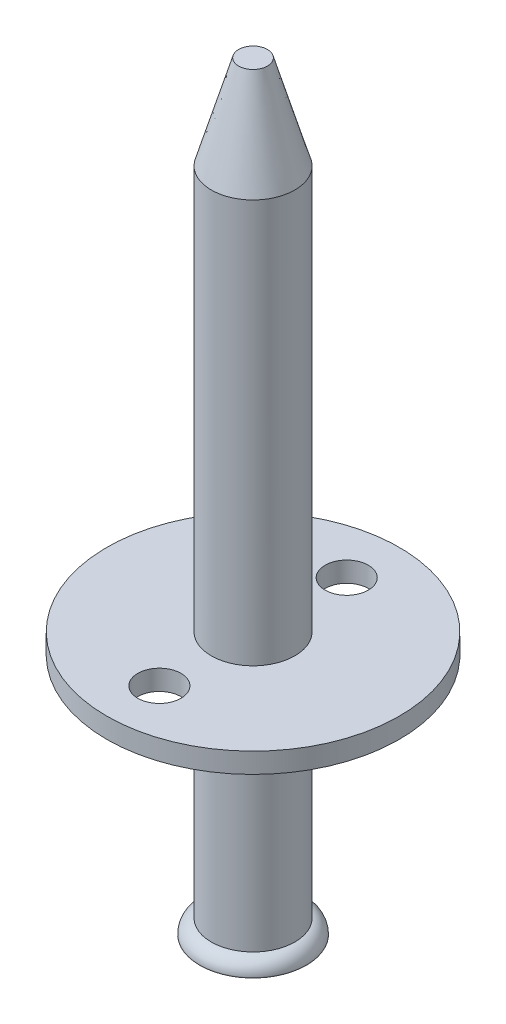
ISO-10303-21;
HEADER;
FILE_DESCRIPTION(('STEP AP214'),'2;1');
FILE_NAME('part.step','',(''),(''),'','','');
FILE_SCHEMA(('AUTOMOTIVE_DESIGN { 1 0 10303 214 1 1 1 1 }'));
ENDSEC;
DATA;
#1=APPLICATION_CONTEXT('core data for automotive mechanical design processes');
#2=APPLICATION_PROTOCOL_DEFINITION('international standard','automotive_design',2000,#1);
#3=PRODUCT_CONTEXT('',#1,'mechanical');
#4=PRODUCT('Part','Part','',(#3));
#5=PRODUCT_RELATED_PRODUCT_CATEGORY('part','',(#4));
#6=PRODUCT_DEFINITION_FORMATION('','',#4);
#7=PRODUCT_DEFINITION_CONTEXT('part definition',#1,'design');
#8=PRODUCT_DEFINITION('design','',#6,#7);
#9=PRODUCT_DEFINITION_SHAPE('','',#8);
#10=(LENGTH_UNIT() NAMED_UNIT(*) SI_UNIT(.MILLI.,.METRE.));
#11=(NAMED_UNIT(*) PLANE_ANGLE_UNIT() SI_UNIT($,.RADIAN.));
#12=(NAMED_UNIT(*) SI_UNIT($,.STERADIAN.) SOLID_ANGLE_UNIT());
#13=UNCERTAINTY_MEASURE_WITH_UNIT(LENGTH_MEASURE(1.E-05),#10,'distance_accuracy_value','');
#14=(GEOMETRIC_REPRESENTATION_CONTEXT(3) GLOBAL_UNCERTAINTY_ASSIGNED_CONTEXT((#13)) GLOBAL_UNIT_ASSIGNED_CONTEXT((#10,
#11,#12)) REPRESENTATION_CONTEXT('',''));
#15=CARTESIAN_POINT('',(0.,0.,0.));
#16=DIRECTION('',(0.,0.,1.));
#17=DIRECTION('',(1.,0.,0.));
#18=AXIS2_PLACEMENT_3D('',#15,#16,#17);
#19=CARTESIAN_POINT('',(0.,45.2,0.));
#20=DIRECTION('',(0.,-1.,0.));
#21=DIRECTION('',(0.,0.,-1.));
#22=AXIS2_PLACEMENT_3D('',#19,#20,#21);
#23=CYLINDRICAL_SURFACE('',#22,2.9);
#24=CARTESIAN_POINT('',(0.,0.,0.));
#25=DIRECTION('',(0.,1.,0.));
#26=DIRECTION('',(0.,0.,1.));
#27=AXIS2_PLACEMENT_3D('',#24,#25,#26);
#28=CIRCLE('',#27,2.9);
#29=CARTESIAN_POINT('',(0.,0.,2.9));
#30=VERTEX_POINT('',#29);
#31=EDGE_CURVE('E62',#30,#30,#28,.T.);
#32=ORIENTED_EDGE('',*,*,#31,.T.);
#33=EDGE_LOOP('',(#32));
#34=FACE_BOUND('',#33,.T.);
#35=CARTESIAN_POINT('',(0.,15.8,0.));
#36=DIRECTION('',(0.,1.,0.));
#37=DIRECTION('',(0.,0.,1.));
#38=AXIS2_PLACEMENT_3D('',#35,#36,#37);
#39=CIRCLE('',#38,2.9);
#40=CARTESIAN_POINT('',(0.,15.8,2.9));
#41=VERTEX_POINT('',#40);
#42=EDGE_CURVE('E11',#41,#41,#39,.T.);
#43=ORIENTED_EDGE('',*,*,#42,.F.);
#44=EDGE_LOOP('',(#43));
#45=FACE_BOUND('',#44,.T.);
#46=ADVANCED_FACE('F41',(#34,#45),#23,.T.);
#47=CARTESIAN_POINT('',(0.,-1.,0.));
#48=DIRECTION('',(0.,1.,0.));
#49=DIRECTION('',(0.,0.,1.));
#50=AXIS2_PLACEMENT_3D('',#47,#48,#49);
#51=CYLINDRICAL_SURFACE('',#50,3.7);
#52=CARTESIAN_POINT('',(0.,-0.979795897113271,0.));
#53=DIRECTION('',(0.,1.,0.));
#54=DIRECTION('',(0.,0.,1.));
#55=AXIS2_PLACEMENT_3D('',#52,#53,#54);
#56=CIRCLE('',#55,3.7);
#57=CARTESIAN_POINT('',(0.,-0.979795897113271,3.7));
#58=VERTEX_POINT('',#57);
#59=EDGE_CURVE('E50',#58,#58,#56,.F.);
#60=ORIENTED_EDGE('',*,*,#59,.T.);
#61=EDGE_LOOP('',(#60));
#62=FACE_BOUND('',#61,.T.);
#63=CARTESIAN_POINT('',(0.,-1.,0.));
#64=DIRECTION('',(0.,-1.,0.));
#65=DIRECTION('',(0.,0.,-1.));
#66=AXIS2_PLACEMENT_3D('',#63,#64,#65);
#67=CIRCLE('',#66,3.7);
#68=CARTESIAN_POINT('',(0.,-1.,-3.7));
#69=VERTEX_POINT('',#68);
#70=EDGE_CURVE('E67',#69,#69,#67,.T.);
#71=ORIENTED_EDGE('',*,*,#70,.F.);
#72=EDGE_LOOP('',(#71));
#73=FACE_BOUND('',#72,.T.);
#74=ADVANCED_FACE('F157',(#62,#73),#51,.T.);
#75=CARTESIAN_POINT('',(0.,-1.,0.));
#76=DIRECTION('',(0.,-1.,0.));
#77=DIRECTION('',(0.,0.,-1.));
#78=AXIS2_PLACEMENT_3D('',#75,#76,#77);
#79=PLANE('',#78);
#80=ORIENTED_EDGE('',*,*,#70,.T.);
#81=EDGE_LOOP('',(#80));
#82=FACE_BOUND('',#81,.T.);
#83=ADVANCED_FACE('F154',(#82),#79,.T.);
#84=CARTESIAN_POINT('',(0.,-0.979795897113271,0.));
#85=DIRECTION('',(0.,1.,0.));
#86=DIRECTION('',(0.,0.,1.));
#87=AXIS2_PLACEMENT_3D('',#84,#85,#86);
#88=TOROIDAL_SURFACE('',#87,2.7,1.);
#89=ORIENTED_EDGE('',*,*,#31,.F.);
#90=EDGE_LOOP('',(#89));
#91=FACE_BOUND('',#90,.T.);
#92=ORIENTED_EDGE('',*,*,#59,.F.);
#93=EDGE_LOOP('',(#92));
#94=FACE_BOUND('',#93,.T.);
#95=ADVANCED_FACE('F43',(#91,#94),#88,.T.);
#96=CARTESIAN_POINT('',(0.,15.8,6.5));
#97=DIRECTION('',(0.,1.,0.));
#98=DIRECTION('',(0.,0.,1.));
#99=AXIS2_PLACEMENT_3D('',#96,#97,#98);
#100=CYLINDRICAL_SURFACE('',#99,1.5);
#101=CARTESIAN_POINT('',(0.,15.8,6.5));
#102=DIRECTION('',(0.,1.,0.));
#103=DIRECTION('',(0.,0.,1.));
#104=AXIS2_PLACEMENT_3D('',#101,#102,#103);
#105=CIRCLE('',#104,1.5);
#106=CARTESIAN_POINT('',(0.,15.8,8.));
#107=VERTEX_POINT('',#106);
#108=EDGE_CURVE('E93',#107,#107,#105,.T.);
#109=ORIENTED_EDGE('',*,*,#108,.F.);
#110=EDGE_LOOP('',(#109));
#111=FACE_BOUND('',#110,.T.);
#112=CARTESIAN_POINT('',(0.,17.2,6.5));
#113=DIRECTION('',(0.,1.,0.));
#114=DIRECTION('',(0.,0.,1.));
#115=AXIS2_PLACEMENT_3D('',#112,#113,#114);
#116=CIRCLE('',#115,1.5);
#117=CARTESIAN_POINT('',(0.,17.2,8.));
#118=VERTEX_POINT('',#117);
#119=EDGE_CURVE('E80',#118,#118,#116,.T.);
#120=ORIENTED_EDGE('',*,*,#119,.T.);
#121=EDGE_LOOP('',(#120));
#122=FACE_BOUND('',#121,.T.);
#123=ADVANCED_FACE('F147',(#111,#122),#100,.F.);
#124=CARTESIAN_POINT('',(0.,15.8,-6.5));
#125=DIRECTION('',(0.,1.,0.));
#126=DIRECTION('',(0.,0.,1.));
#127=AXIS2_PLACEMENT_3D('',#124,#125,#126);
#128=CYLINDRICAL_SURFACE('',#127,1.5);
#129=CARTESIAN_POINT('',(0.,15.8,-6.5));
#130=DIRECTION('',(0.,1.,0.));
#131=DIRECTION('',(0.,0.,1.));
#132=AXIS2_PLACEMENT_3D('',#129,#130,#131);
#133=CIRCLE('',#132,1.5);
#134=CARTESIAN_POINT('',(0.,15.8,-5.));
#135=VERTEX_POINT('',#134);
#136=EDGE_CURVE('E79',#135,#135,#133,.T.);
#137=ORIENTED_EDGE('',*,*,#136,.F.);
#138=EDGE_LOOP('',(#137));
#139=FACE_BOUND('',#138,.T.);
#140=CARTESIAN_POINT('',(0.,17.2,-6.5));
#141=DIRECTION('',(0.,1.,0.));
#142=DIRECTION('',(0.,0.,1.));
#143=AXIS2_PLACEMENT_3D('',#140,#141,#142);
#144=CIRCLE('',#143,1.5);
#145=CARTESIAN_POINT('',(0.,17.2,-5.));
#146=VERTEX_POINT('',#145);
#147=EDGE_CURVE('E84',#146,#146,#144,.T.);
#148=ORIENTED_EDGE('',*,*,#147,.T.);
#149=EDGE_LOOP('',(#148));
#150=FACE_BOUND('',#149,.T.);
#151=ADVANCED_FACE('F145',(#139,#150),#128,.F.);
#152=CARTESIAN_POINT('',(0.,15.8,0.));
#153=DIRECTION('',(0.,1.,0.));
#154=DIRECTION('',(0.,0.,1.));
#155=AXIS2_PLACEMENT_3D('',#152,#153,#154);
#156=CYLINDRICAL_SURFACE('',#155,10.15);
#157=CARTESIAN_POINT('',(0.,15.8,0.));
#158=DIRECTION('',(0.,1.,0.));
#159=DIRECTION('',(0.,0.,1.));
#160=AXIS2_PLACEMENT_3D('',#157,#158,#159);
#161=CIRCLE('',#160,10.15);
#162=CARTESIAN_POINT('',(0.,15.8,10.15));
#163=VERTEX_POINT('',#162);
#164=EDGE_CURVE('E89',#163,#163,#161,.T.);
#165=ORIENTED_EDGE('',*,*,#164,.T.);
#166=EDGE_LOOP('',(#165));
#167=FACE_BOUND('',#166,.T.);
#168=CARTESIAN_POINT('',(0.,17.2,0.));
#169=DIRECTION('',(0.,1.,0.));
#170=DIRECTION('',(0.,0.,1.));
#171=AXIS2_PLACEMENT_3D('',#168,#169,#170);
#172=CIRCLE('',#171,10.15);
#173=CARTESIAN_POINT('',(0.,17.2,10.15));
#174=VERTEX_POINT('',#173);
#175=EDGE_CURVE('E75',#174,#174,#172,.T.);
#176=ORIENTED_EDGE('',*,*,#175,.F.);
#177=EDGE_LOOP('',(#176));
#178=FACE_BOUND('',#177,.T.);
#179=ADVANCED_FACE('F139',(#167,#178),#156,.T.);
#180=CARTESIAN_POINT('',(0.,15.8,0.));
#181=DIRECTION('',(0.,1.,0.));
#182=DIRECTION('',(0.,0.,1.));
#183=AXIS2_PLACEMENT_3D('',#180,#181,#182);
#184=PLANE('',#183);
#185=ORIENTED_EDGE('',*,*,#42,.T.);
#186=EDGE_LOOP('',(#185));
#187=FACE_BOUND('',#186,.T.);
#188=ORIENTED_EDGE('',*,*,#136,.T.);
#189=EDGE_LOOP('',(#188));
#190=FACE_BOUND('',#189,.T.);
#191=ORIENTED_EDGE('',*,*,#108,.T.);
#192=EDGE_LOOP('',(#191));
#193=FACE_BOUND('',#192,.T.);
#194=ORIENTED_EDGE('',*,*,#164,.F.);
#195=EDGE_LOOP('',(#194));
#196=FACE_BOUND('',#195,.T.);
#197=ADVANCED_FACE('F126',(#187,#190,#193,#196),#184,.F.);
#198=CARTESIAN_POINT('',(0.,17.2,0.));
#199=DIRECTION('',(0.,1.,0.));
#200=DIRECTION('',(0.,0.,1.));
#201=AXIS2_PLACEMENT_3D('',#198,#199,#200);
#202=PLANE('',#201);
#203=CARTESIAN_POINT('',(0.,17.2,0.));
#204=DIRECTION('',(0.,1.,0.));
#205=DIRECTION('',(0.,0.,1.));
#206=AXIS2_PLACEMENT_3D('',#203,#204,#205);
#207=CIRCLE('',#206,2.9);
#208=CARTESIAN_POINT('',(0.,17.2,2.9));
#209=VERTEX_POINT('',#208);
#210=EDGE_CURVE('E59',#209,#209,#207,.T.);
#211=ORIENTED_EDGE('',*,*,#210,.F.);
#212=EDGE_LOOP('',(#211));
#213=FACE_BOUND('',#212,.T.);
#214=ORIENTED_EDGE('',*,*,#147,.F.);
#215=EDGE_LOOP('',(#214));
#216=FACE_BOUND('',#215,.T.);
#217=ORIENTED_EDGE('',*,*,#119,.F.);
#218=EDGE_LOOP('',(#217));
#219=FACE_BOUND('',#218,.T.);
#220=ORIENTED_EDGE('',*,*,#175,.T.);
#221=EDGE_LOOP('',(#220));
#222=FACE_BOUND('',#221,.T.);
#223=ADVANCED_FACE('F138',(#213,#216,#219,#222),#202,.T.);
#224=ORIENTED_EDGE('',*,*,#210,.T.);
#225=EDGE_LOOP('',(#224));
#226=FACE_BOUND('',#225,.T.);
#227=CARTESIAN_POINT('',(0.,45.2,0.));
#228=DIRECTION('',(0.,-1.,0.));
#229=DIRECTION('',(0.,0.,-1.));
#230=AXIS2_PLACEMENT_3D('',#227,#228,#229);
#231=CIRCLE('',#230,2.9);
#232=CARTESIAN_POINT('',(0.,45.2,-2.9));
#233=VERTEX_POINT('',#232);
#234=EDGE_CURVE('E56',#233,#233,#231,.F.);
#235=ORIENTED_EDGE('',*,*,#234,.F.);
#236=EDGE_LOOP('',(#235));
#237=FACE_BOUND('',#236,.T.);
#238=ADVANCED_FACE('F120',(#226,#237),#23,.T.);
#239=CARTESIAN_POINT('',(0.,51.7,0.));
#240=DIRECTION('',(0.,1.,0.));
#241=DIRECTION('',(0.,0.,1.));
#242=AXIS2_PLACEMENT_3D('',#239,#240,#241);
#243=PLANE('',#242);
#244=CARTESIAN_POINT('',(0.,51.7,0.));
#245=DIRECTION('',(0.,1.,0.));
#246=DIRECTION('',(0.,0.,1.));
#247=AXIS2_PLACEMENT_3D('',#244,#245,#246);
#248=CIRCLE('',#247,1.);
#249=CARTESIAN_POINT('',(0.,51.7,1.));
#250=VERTEX_POINT('',#249);
#251=EDGE_CURVE('E88',#250,#250,#248,.T.);
#252=ORIENTED_EDGE('',*,*,#251,.T.);
#253=EDGE_LOOP('',(#252));
#254=FACE_BOUND('',#253,.T.);
#255=ADVANCED_FACE('F110',(#254),#243,.T.);
#256=CARTESIAN_POINT('',(0.,51.7,0.));
#257=DIRECTION('',(0.,-1.,0.));
#258=DIRECTION('',(0.,0.,-1.));
#259=AXIS2_PLACEMENT_3D('',#256,#257,#258);
#260=CONICAL_SURFACE('',#259,1.,0.284384776593859);
#261=ORIENTED_EDGE('',*,*,#251,.F.);
#262=EDGE_LOOP('',(#261));
#263=FACE_BOUND('',#262,.T.);
#264=ORIENTED_EDGE('',*,*,#234,.T.);
#265=EDGE_LOOP('',(#264));
#266=FACE_BOUND('',#265,.T.);
#267=ADVANCED_FACE('F119',(#263,#266),#260,.T.);
#268=CLOSED_SHELL('',(#46,#74,#83,#95,#123,#151,#179,#197,#223,#238,#255,#267));
#269=MANIFOLD_SOLID_BREP('B2',#268);
#270=ADVANCED_BREP_SHAPE_REPRESENTATION('',(#18,#269),#14);
#271=SHAPE_DEFINITION_REPRESENTATION(#9,#270);
ENDSEC;
END-ISO-10303-21;
